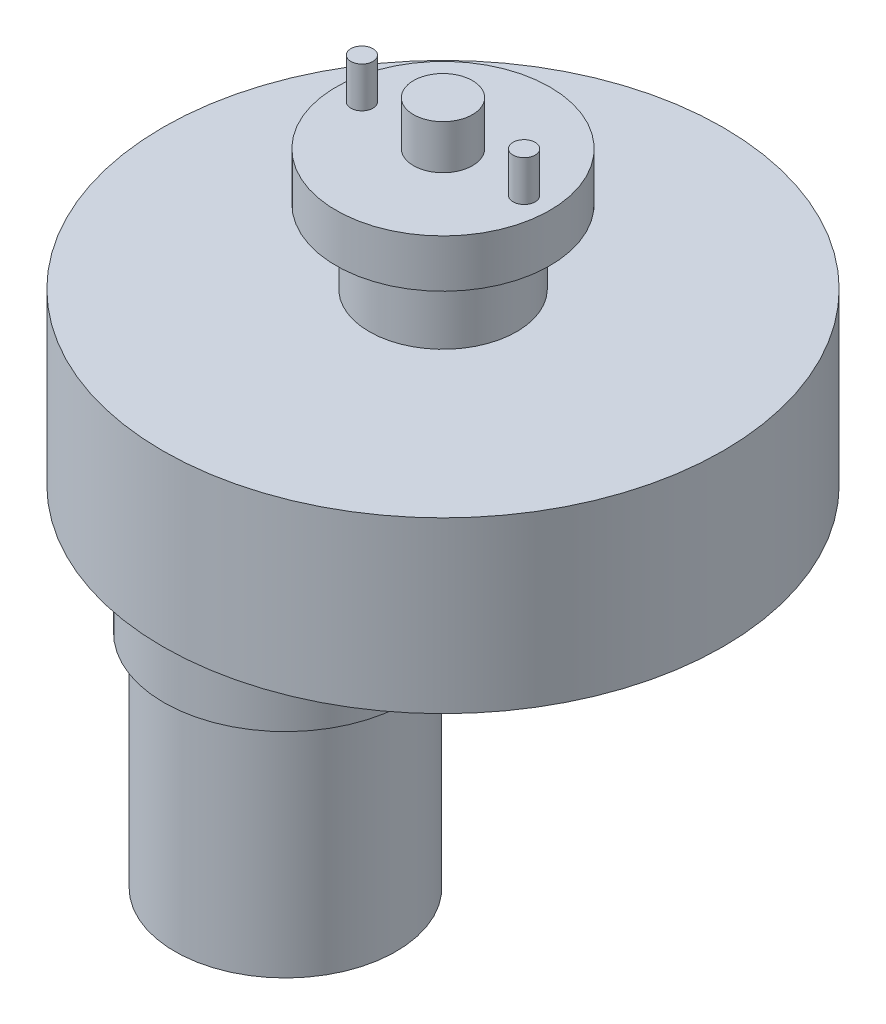
ISO-10303-21;
HEADER;
FILE_DESCRIPTION(('STEP AP214'),'2;1');
FILE_NAME('part.step','',(''),(''),'','','');
FILE_SCHEMA(('AUTOMOTIVE_DESIGN { 1 0 10303 214 1 1 1 1 }'));
ENDSEC;
DATA;
#1=APPLICATION_CONTEXT('core data for automotive mechanical design processes');
#2=APPLICATION_PROTOCOL_DEFINITION('international standard','automotive_design',2000,#1);
#3=PRODUCT_CONTEXT('',#1,'mechanical');
#4=PRODUCT('Part','Part','',(#3));
#5=PRODUCT_RELATED_PRODUCT_CATEGORY('part','',(#4));
#6=PRODUCT_DEFINITION_FORMATION('','',#4);
#7=PRODUCT_DEFINITION_CONTEXT('part definition',#1,'design');
#8=PRODUCT_DEFINITION('design','',#6,#7);
#9=PRODUCT_DEFINITION_SHAPE('','',#8);
#10=(LENGTH_UNIT() NAMED_UNIT(*) SI_UNIT(.MILLI.,.METRE.));
#11=(NAMED_UNIT(*) PLANE_ANGLE_UNIT() SI_UNIT($,.RADIAN.));
#12=(NAMED_UNIT(*) SI_UNIT($,.STERADIAN.) SOLID_ANGLE_UNIT());
#13=UNCERTAINTY_MEASURE_WITH_UNIT(LENGTH_MEASURE(1.E-05),#10,'distance_accuracy_value','');
#14=(GEOMETRIC_REPRESENTATION_CONTEXT(3) GLOBAL_UNCERTAINTY_ASSIGNED_CONTEXT((#13)) GLOBAL_UNIT_ASSIGNED_CONTEXT((#10,
#11,#12)) REPRESENTATION_CONTEXT('',''));
#15=CARTESIAN_POINT('',(0.,0.,0.));
#16=DIRECTION('',(0.,0.,1.));
#17=DIRECTION('',(1.,0.,0.));
#18=AXIS2_PLACEMENT_3D('',#15,#16,#17);
#19=CARTESIAN_POINT('',(-21.3727405232621,-28.,0.));
#20=DIRECTION('',(0.,-1.,0.));
#21=DIRECTION('',(0.,0.,-1.));
#22=AXIS2_PLACEMENT_3D('',#19,#20,#21);
#23=PLANE('',#22);
#24=CARTESIAN_POINT('',(-21.3727405232621,-28.,0.));
#25=DIRECTION('',(0.,-1.,0.));
#26=DIRECTION('',(0.,0.,-1.));
#27=AXIS2_PLACEMENT_3D('',#24,#25,#26);
#28=CIRCLE('',#27,16.5);
#29=CARTESIAN_POINT('',(-21.3727405232621,-28.,-16.5));
#30=VERTEX_POINT('',#29);
#31=EDGE_CURVE('E73',#30,#30,#28,.T.);
#32=ORIENTED_EDGE('',*,*,#31,.T.);
#33=EDGE_LOOP('',(#32));
#34=FACE_BOUND('',#33,.T.);
#35=CARTESIAN_POINT('',(-21.3727405232621,-28.,0.));
#36=DIRECTION('',(0.,-1.,0.));
#37=DIRECTION('',(0.,0.,-1.));
#38=AXIS2_PLACEMENT_3D('',#35,#36,#37);
#39=CIRCLE('',#38,15.);
#40=CARTESIAN_POINT('',(-21.3727405232621,-28.,-15.));
#41=VERTEX_POINT('',#40);
#42=EDGE_CURVE('E79',#41,#41,#39,.T.);
#43=ORIENTED_EDGE('',*,*,#42,.F.);
#44=EDGE_LOOP('',(#43));
#45=FACE_BOUND('',#44,.T.);
#46=ADVANCED_FACE('F28',(#34,#45),#23,.T.);
#47=CARTESIAN_POINT('',(0.,0.,0.));
#48=DIRECTION('',(0.,1.,0.));
#49=DIRECTION('',(0.,0.,1.));
#50=AXIS2_PLACEMENT_3D('',#47,#48,#49);
#51=PLANE('',#50);
#52=CARTESIAN_POINT('',(0.,0.,0.));
#53=DIRECTION('',(0.,1.,0.));
#54=DIRECTION('',(0.,0.,1.));
#55=AXIS2_PLACEMENT_3D('',#52,#53,#54);
#56=CIRCLE('',#55,38.);
#57=CARTESIAN_POINT('',(0.,0.,38.));
#58=VERTEX_POINT('',#57);
#59=EDGE_CURVE('E39',#58,#58,#56,.T.);
#60=ORIENTED_EDGE('',*,*,#59,.F.);
#61=EDGE_LOOP('',(#60));
#62=FACE_BOUND('',#61,.T.);
#63=CARTESIAN_POINT('',(-21.3727405232621,0.,0.));
#64=DIRECTION('',(0.,1.,0.));
#65=DIRECTION('',(0.,0.,1.));
#66=AXIS2_PLACEMENT_3D('',#63,#64,#65);
#67=CIRCLE('',#66,16.5);
#68=CARTESIAN_POINT('',(-21.3727405232621,0.,16.5));
#69=VERTEX_POINT('',#68);
#70=EDGE_CURVE('E10',#69,#69,#67,.F.);
#71=ORIENTED_EDGE('',*,*,#70,.F.);
#72=EDGE_LOOP('',(#71));
#73=FACE_BOUND('',#72,.T.);
#74=ADVANCED_FACE('F95',(#62,#73),#51,.F.);
#75=CARTESIAN_POINT('',(0.,39.5,0.));
#76=DIRECTION('',(0.,1.,0.));
#77=DIRECTION('',(0.,0.,1.));
#78=AXIS2_PLACEMENT_3D('',#75,#76,#77);
#79=PLANE('',#78);
#80=CARTESIAN_POINT('',(-11.,39.5,0.));
#81=DIRECTION('',(0.,1.,0.));
#82=DIRECTION('',(0.,0.,1.));
#83=AXIS2_PLACEMENT_3D('',#80,#81,#82);
#84=CIRCLE('',#83,1.5);
#85=CARTESIAN_POINT('',(-11.,39.5,1.5));
#86=VERTEX_POINT('',#85);
#87=EDGE_CURVE('E64',#86,#86,#84,.T.);
#88=ORIENTED_EDGE('',*,*,#87,.F.);
#89=EDGE_LOOP('',(#88));
#90=FACE_BOUND('',#89,.T.);
#91=CARTESIAN_POINT('',(0.,39.5,0.));
#92=DIRECTION('',(0.,1.,0.));
#93=DIRECTION('',(0.,0.,1.));
#94=AXIS2_PLACEMENT_3D('',#91,#92,#93);
#95=CIRCLE('',#94,14.5);
#96=CARTESIAN_POINT('',(0.,39.5,-14.5));
#97=VERTEX_POINT('',#96);
#98=EDGE_CURVE('E49',#97,#97,#95,.T.);
#99=ORIENTED_EDGE('',*,*,#98,.T.);
#100=EDGE_LOOP('',(#99));
#101=FACE_BOUND('',#100,.T.);
#102=CARTESIAN_POINT('',(0.,39.5,0.));
#103=DIRECTION('',(0.,1.,0.));
#104=DIRECTION('',(0.,0.,1.));
#105=AXIS2_PLACEMENT_3D('',#102,#103,#104);
#106=CIRCLE('',#105,4.);
#107=CARTESIAN_POINT('',(0.,39.5,4.));
#108=VERTEX_POINT('',#107);
#109=EDGE_CURVE('E58',#108,#108,#106,.T.);
#110=ORIENTED_EDGE('',*,*,#109,.F.);
#111=EDGE_LOOP('',(#110));
#112=FACE_BOUND('',#111,.T.);
#113=CARTESIAN_POINT('',(11.,39.5,0.));
#114=DIRECTION('',(0.,1.,0.));
#115=DIRECTION('',(0.,0.,1.));
#116=AXIS2_PLACEMENT_3D('',#113,#114,#115);
#117=CIRCLE('',#116,1.5);
#118=CARTESIAN_POINT('',(11.,39.5,1.5));
#119=VERTEX_POINT('',#118);
#120=EDGE_CURVE('E70',#119,#119,#117,.T.);
#121=ORIENTED_EDGE('',*,*,#120,.F.);
#122=EDGE_LOOP('',(#121));
#123=FACE_BOUND('',#122,.T.);
#124=ADVANCED_FACE('F101',(#90,#101,#112,#123),#79,.T.);
#125=CARTESIAN_POINT('',(0.,23.,0.));
#126=DIRECTION('',(0.,1.,0.));
#127=DIRECTION('',(0.,0.,1.));
#128=AXIS2_PLACEMENT_3D('',#125,#126,#127);
#129=PLANE('',#128);
#130=CARTESIAN_POINT('',(0.,23.,0.));
#131=DIRECTION('',(0.,1.,0.));
#132=DIRECTION('',(0.,0.,1.));
#133=AXIS2_PLACEMENT_3D('',#130,#131,#132);
#134=CIRCLE('',#133,38.);
#135=CARTESIAN_POINT('',(0.,23.,38.));
#136=VERTEX_POINT('',#135);
#137=EDGE_CURVE('E35',#136,#136,#134,.T.);
#138=ORIENTED_EDGE('',*,*,#137,.T.);
#139=EDGE_LOOP('',(#138));
#140=FACE_BOUND('',#139,.T.);
#141=CARTESIAN_POINT('',(0.,23.,0.));
#142=DIRECTION('',(0.,1.,0.));
#143=DIRECTION('',(0.,0.,1.));
#144=AXIS2_PLACEMENT_3D('',#141,#142,#143);
#145=CIRCLE('',#144,10.);
#146=CARTESIAN_POINT('',(0.,23.,10.));
#147=VERTEX_POINT('',#146);
#148=EDGE_CURVE('E46',#147,#147,#145,.T.);
#149=ORIENTED_EDGE('',*,*,#148,.F.);
#150=EDGE_LOOP('',(#149));
#151=FACE_BOUND('',#150,.T.);
#152=ADVANCED_FACE('F135',(#140,#151),#129,.T.);
#153=CARTESIAN_POINT('',(0.,23.,0.));
#154=DIRECTION('',(0.,-1.,0.));
#155=DIRECTION('',(0.,0.,-1.));
#156=AXIS2_PLACEMENT_3D('',#153,#154,#155);
#157=CYLINDRICAL_SURFACE('',#156,38.);
#158=ORIENTED_EDGE('',*,*,#137,.F.);
#159=EDGE_LOOP('',(#158));
#160=FACE_BOUND('',#159,.T.);
#161=ORIENTED_EDGE('',*,*,#59,.T.);
#162=EDGE_LOOP('',(#161));
#163=FACE_BOUND('',#162,.T.);
#164=ADVANCED_FACE('F30',(#160,#163),#157,.T.);
#165=CARTESIAN_POINT('',(0.,33.,0.));
#166=DIRECTION('',(0.,-1.,0.));
#167=DIRECTION('',(0.,0.,-1.));
#168=AXIS2_PLACEMENT_3D('',#165,#166,#167);
#169=CYLINDRICAL_SURFACE('',#168,10.);
#170=CARTESIAN_POINT('',(0.,33.,0.));
#171=DIRECTION('',(0.,1.,0.));
#172=DIRECTION('',(0.,0.,1.));
#173=AXIS2_PLACEMENT_3D('',#170,#171,#172);
#174=CIRCLE('',#173,10.);
#175=CARTESIAN_POINT('',(0.,33.,10.));
#176=VERTEX_POINT('',#175);
#177=EDGE_CURVE('E44',#176,#176,#174,.T.);
#178=ORIENTED_EDGE('',*,*,#177,.F.);
#179=EDGE_LOOP('',(#178));
#180=FACE_BOUND('',#179,.T.);
#181=ORIENTED_EDGE('',*,*,#148,.T.);
#182=EDGE_LOOP('',(#181));
#183=FACE_BOUND('',#182,.T.);
#184=ADVANCED_FACE('F140',(#180,#183),#169,.T.);
#185=CARTESIAN_POINT('',(0.,33.,0.));
#186=DIRECTION('',(0.,1.,0.));
#187=DIRECTION('',(0.,0.,1.));
#188=AXIS2_PLACEMENT_3D('',#185,#186,#187);
#189=PLANE('',#188);
#190=CARTESIAN_POINT('',(0.,33.,0.));
#191=DIRECTION('',(0.,1.,0.));
#192=DIRECTION('',(0.,0.,1.));
#193=AXIS2_PLACEMENT_3D('',#190,#191,#192);
#194=CIRCLE('',#193,14.5);
#195=CARTESIAN_POINT('',(0.,33.,-14.5));
#196=VERTEX_POINT('',#195);
#197=EDGE_CURVE('E52',#196,#196,#194,.T.);
#198=ORIENTED_EDGE('',*,*,#197,.F.);
#199=EDGE_LOOP('',(#198));
#200=FACE_BOUND('',#199,.T.);
#201=ORIENTED_EDGE('',*,*,#177,.T.);
#202=EDGE_LOOP('',(#201));
#203=FACE_BOUND('',#202,.T.);
#204=ADVANCED_FACE('F137',(#200,#203),#189,.F.);
#205=CARTESIAN_POINT('',(0.,39.5,0.));
#206=DIRECTION('',(0.,-1.,0.));
#207=DIRECTION('',(0.,0.,-1.));
#208=AXIS2_PLACEMENT_3D('',#205,#206,#207);
#209=CYLINDRICAL_SURFACE('',#208,14.5);
#210=CARTESIAN_POINT('',(0.,39.5,-14.5));
#211=CARTESIAN_POINT('',(0.,39.4322916666667,-14.5));
#212=CARTESIAN_POINT('',(0.,39.3645833333333,-14.5));
#213=CARTESIAN_POINT('',(0.,39.2291666666667,-14.5));
#214=CARTESIAN_POINT('',(0.,39.1614583333333,-14.5));
#215=CARTESIAN_POINT('',(0.,39.0260416666667,-14.5));
#216=CARTESIAN_POINT('',(0.,38.9583333333333,-14.5));
#217=CARTESIAN_POINT('',(0.,38.8229166666667,-14.5));
#218=CARTESIAN_POINT('',(0.,38.7552083333333,-14.5));
#219=CARTESIAN_POINT('',(0.,38.6197916666667,-14.5));
#220=CARTESIAN_POINT('',(0.,38.5520833333333,-14.5));
#221=CARTESIAN_POINT('',(0.,38.4166666666667,-14.5));
#222=CARTESIAN_POINT('',(0.,38.3489583333333,-14.5));
#223=CARTESIAN_POINT('',(0.,38.2135416666667,-14.5));
#224=CARTESIAN_POINT('',(0.,38.1458333333333,-14.5));
#225=CARTESIAN_POINT('',(0.,38.0104166666667,-14.5));
#226=CARTESIAN_POINT('',(0.,37.9427083333333,-14.5));
#227=CARTESIAN_POINT('',(0.,37.8072916666667,-14.5));
#228=CARTESIAN_POINT('',(0.,37.7395833333333,-14.5));
#229=CARTESIAN_POINT('',(0.,37.6041666666667,-14.5));
#230=CARTESIAN_POINT('',(0.,37.5364583333333,-14.5));
#231=CARTESIAN_POINT('',(0.,37.4010416666667,-14.5));
#232=CARTESIAN_POINT('',(0.,37.3333333333333,-14.5));
#233=CARTESIAN_POINT('',(0.,37.1979166666667,-14.5));
#234=CARTESIAN_POINT('',(0.,37.1302083333333,-14.5));
#235=CARTESIAN_POINT('',(0.,36.9947916666667,-14.5));
#236=CARTESIAN_POINT('',(0.,36.9270833333333,-14.5));
#237=CARTESIAN_POINT('',(0.,36.7916666666667,-14.5));
#238=CARTESIAN_POINT('',(0.,36.7239583333333,-14.5));
#239=CARTESIAN_POINT('',(0.,36.5885416666667,-14.5));
#240=CARTESIAN_POINT('',(0.,36.5208333333333,-14.5));
#241=CARTESIAN_POINT('',(0.,36.3854166666667,-14.5));
#242=CARTESIAN_POINT('',(0.,36.3177083333333,-14.5));
#243=CARTESIAN_POINT('',(0.,36.1822916666667,-14.5));
#244=CARTESIAN_POINT('',(0.,36.1145833333333,-14.5));
#245=CARTESIAN_POINT('',(0.,35.9791666666667,-14.5));
#246=CARTESIAN_POINT('',(0.,35.9114583333333,-14.5));
#247=CARTESIAN_POINT('',(0.,35.7760416666667,-14.5));
#248=CARTESIAN_POINT('',(0.,35.7083333333333,-14.5));
#249=CARTESIAN_POINT('',(0.,35.5729166666667,-14.5));
#250=CARTESIAN_POINT('',(0.,35.5052083333333,-14.5));
#251=CARTESIAN_POINT('',(0.,35.3697916666667,-14.5));
#252=CARTESIAN_POINT('',(0.,35.3020833333333,-14.5));
#253=CARTESIAN_POINT('',(0.,35.1666666666667,-14.5));
#254=CARTESIAN_POINT('',(0.,35.0989583333333,-14.5));
#255=CARTESIAN_POINT('',(0.,34.9635416666667,-14.5));
#256=CARTESIAN_POINT('',(0.,34.8958333333333,-14.5));
#257=CARTESIAN_POINT('',(0.,34.7604166666667,-14.5));
#258=CARTESIAN_POINT('',(0.,34.6927083333333,-14.5));
#259=CARTESIAN_POINT('',(0.,34.5572916666667,-14.5));
#260=CARTESIAN_POINT('',(0.,34.4895833333333,-14.5));
#261=CARTESIAN_POINT('',(0.,34.3541666666667,-14.5));
#262=CARTESIAN_POINT('',(0.,34.2864583333333,-14.5));
#263=CARTESIAN_POINT('',(0.,34.1510416666667,-14.5));
#264=CARTESIAN_POINT('',(0.,34.0833333333333,-14.5));
#265=CARTESIAN_POINT('',(0.,33.9479166666667,-14.5));
#266=CARTESIAN_POINT('',(0.,33.8802083333333,-14.5));
#267=CARTESIAN_POINT('',(0.,33.7447916666667,-14.5));
#268=CARTESIAN_POINT('',(0.,33.6770833333333,-14.5));
#269=CARTESIAN_POINT('',(0.,33.5416666666667,-14.5));
#270=CARTESIAN_POINT('',(0.,33.4739583333333,-14.5));
#271=CARTESIAN_POINT('',(0.,33.3385416666667,-14.5));
#272=CARTESIAN_POINT('',(0.,33.2708333333333,-14.5));
#273=CARTESIAN_POINT('',(0.,33.1354166666667,-14.5));
#274=CARTESIAN_POINT('',(0.,33.0677083333333,-14.5));
#275=CARTESIAN_POINT('',(0.,33.,-14.5));
#276=B_SPLINE_CURVE_WITH_KNOTS('',3,(#210,#211,#212,#213,#214,#215,#216,#217,#218,#219,#220,
#221,#222,#223,#224,#225,#226,#227,#228,#229,#230,#231,#232,#233,#234,#235,#236,#237,#238,#239,
#240,#241,#242,#243,#244,#245,#246,#247,#248,#249,#250,#251,#252,#253,#254,#255,#256,#257,#258,
#259,#260,#261,#262,#263,#264,#265,#266,#267,#268,#269,#270,#271,#272,#273,#274,#275),
.UNSPECIFIED.,.F.,.F.,(4,2,2,2,2,2,2,2,2,2,2,2,2,2,2,2,2,2,2,2,2,2,2,2,2,2,2,2,2,2,2,2,4),(0.,
0.203125000000005,0.406250000000004,0.609375000000002,0.812500000000001,1.01562500000001,
1.21875,1.421875,1.625,1.82812500000001,2.03125000000001,2.234375,2.4375,2.640625,
2.84375000000001,3.046875,3.25,3.453125,3.65625000000001,3.85937500000001,4.0625,4.265625,
4.46875,4.67187500000001,4.875,5.078125,5.28125,5.48437500000001,5.68750000000001,5.890625,
6.09375,6.296875,6.50000000000001),.UNSPECIFIED.);
#277=EDGE_CURVE('BSEAM131',#97,#196,#276,.T.);
#278=ORIENTED_EDGE('',*,*,#98,.F.);
#279=ORIENTED_EDGE('',*,*,#197,.T.);
#280=ORIENTED_EDGE('',*,*,#277,.T.);
#281=ORIENTED_EDGE('',*,*,#277,.F.);
#282=EDGE_LOOP('',(#278,#280,#279,#281));
#283=FACE_BOUND('',#282,.T.);
#284=ADVANCED_FACE('F131',(#283),#209,.T.);
#285=CARTESIAN_POINT('',(0.,45.5,0.));
#286=DIRECTION('',(0.,-1.,0.));
#287=DIRECTION('',(0.,0.,-1.));
#288=AXIS2_PLACEMENT_3D('',#285,#286,#287);
#289=CYLINDRICAL_SURFACE('',#288,4.);
#290=CARTESIAN_POINT('',(0.,45.5,0.));
#291=DIRECTION('',(0.,1.,0.));
#292=DIRECTION('',(0.,0.,1.));
#293=AXIS2_PLACEMENT_3D('',#290,#291,#292);
#294=CIRCLE('',#293,4.);
#295=CARTESIAN_POINT('',(0.,45.5,4.));
#296=VERTEX_POINT('',#295);
#297=EDGE_CURVE('E55',#296,#296,#294,.T.);
#298=ORIENTED_EDGE('',*,*,#297,.F.);
#299=EDGE_LOOP('',(#298));
#300=FACE_BOUND('',#299,.T.);
#301=ORIENTED_EDGE('',*,*,#109,.T.);
#302=EDGE_LOOP('',(#301));
#303=FACE_BOUND('',#302,.T.);
#304=ADVANCED_FACE('F127',(#300,#303),#289,.T.);
#305=CARTESIAN_POINT('',(0.,45.5,0.));
#306=DIRECTION('',(0.,1.,0.));
#307=DIRECTION('',(0.,0.,1.));
#308=AXIS2_PLACEMENT_3D('',#305,#306,#307);
#309=PLANE('',#308);
#310=ORIENTED_EDGE('',*,*,#297,.T.);
#311=EDGE_LOOP('',(#310));
#312=FACE_BOUND('',#311,.T.);
#313=ADVANCED_FACE('F123',(#312),#309,.T.);
#314=CARTESIAN_POINT('',(-11.,45.,0.));
#315=DIRECTION('',(0.,-1.,0.));
#316=DIRECTION('',(0.,0.,-1.));
#317=AXIS2_PLACEMENT_3D('',#314,#315,#316);
#318=CYLINDRICAL_SURFACE('',#317,1.5);
#319=CARTESIAN_POINT('',(-11.,45.,0.));
#320=DIRECTION('',(0.,1.,0.));
#321=DIRECTION('',(0.,0.,1.));
#322=AXIS2_PLACEMENT_3D('',#319,#320,#321);
#323=CIRCLE('',#322,1.5);
#324=CARTESIAN_POINT('',(-11.,45.,1.5));
#325=VERTEX_POINT('',#324);
#326=EDGE_CURVE('E61',#325,#325,#323,.T.);
#327=ORIENTED_EDGE('',*,*,#326,.F.);
#328=EDGE_LOOP('',(#327));
#329=FACE_BOUND('',#328,.T.);
#330=ORIENTED_EDGE('',*,*,#87,.T.);
#331=EDGE_LOOP('',(#330));
#332=FACE_BOUND('',#331,.T.);
#333=ADVANCED_FACE('F119',(#329,#332),#318,.T.);
#334=CARTESIAN_POINT('',(-11.,45.,0.));
#335=DIRECTION('',(0.,1.,0.));
#336=DIRECTION('',(0.,0.,1.));
#337=AXIS2_PLACEMENT_3D('',#334,#335,#336);
#338=PLANE('',#337);
#339=ORIENTED_EDGE('',*,*,#326,.T.);
#340=EDGE_LOOP('',(#339));
#341=FACE_BOUND('',#340,.T.);
#342=ADVANCED_FACE('F115',(#341),#338,.T.);
#343=CARTESIAN_POINT('',(11.,45.,0.));
#344=DIRECTION('',(0.,-1.,0.));
#345=DIRECTION('',(0.,0.,-1.));
#346=AXIS2_PLACEMENT_3D('',#343,#344,#345);
#347=CYLINDRICAL_SURFACE('',#346,1.5);
#348=CARTESIAN_POINT('',(11.,45.,0.));
#349=DIRECTION('',(0.,1.,0.));
#350=DIRECTION('',(0.,0.,1.));
#351=AXIS2_PLACEMENT_3D('',#348,#349,#350);
#352=CIRCLE('',#351,1.5);
#353=CARTESIAN_POINT('',(11.,45.,1.5));
#354=VERTEX_POINT('',#353);
#355=EDGE_CURVE('E67',#354,#354,#352,.T.);
#356=ORIENTED_EDGE('',*,*,#355,.F.);
#357=EDGE_LOOP('',(#356));
#358=FACE_BOUND('',#357,.T.);
#359=ORIENTED_EDGE('',*,*,#120,.T.);
#360=EDGE_LOOP('',(#359));
#361=FACE_BOUND('',#360,.T.);
#362=ADVANCED_FACE('F111',(#358,#361),#347,.T.);
#363=CARTESIAN_POINT('',(11.,45.,0.));
#364=DIRECTION('',(0.,1.,0.));
#365=DIRECTION('',(0.,0.,1.));
#366=AXIS2_PLACEMENT_3D('',#363,#364,#365);
#367=PLANE('',#366);
#368=ORIENTED_EDGE('',*,*,#355,.T.);
#369=EDGE_LOOP('',(#368));
#370=FACE_BOUND('',#369,.T.);
#371=ADVANCED_FACE('F107',(#370),#367,.T.);
#372=CARTESIAN_POINT('',(-21.3727405232621,-28.,0.));
#373=DIRECTION('',(0.,1.,0.));
#374=DIRECTION('',(0.,0.,1.));
#375=AXIS2_PLACEMENT_3D('',#372,#373,#374);
#376=CYLINDRICAL_SURFACE('',#375,16.5);
#377=ORIENTED_EDGE('',*,*,#31,.F.);
#378=EDGE_LOOP('',(#377));
#379=FACE_BOUND('',#378,.T.);
#380=ORIENTED_EDGE('',*,*,#70,.T.);
#381=EDGE_LOOP('',(#380));
#382=FACE_BOUND('',#381,.T.);
#383=ADVANCED_FACE('F90',(#379,#382),#376,.T.);
#384=CARTESIAN_POINT('',(-21.3727405232621,-58.,0.));
#385=DIRECTION('',(0.,1.,0.));
#386=DIRECTION('',(0.,0.,1.));
#387=AXIS2_PLACEMENT_3D('',#384,#385,#386);
#388=CYLINDRICAL_SURFACE('',#387,15.);
#389=CARTESIAN_POINT('',(-21.3727405232621,-58.,0.));
#390=DIRECTION('',(0.,-1.,0.));
#391=DIRECTION('',(0.,0.,-1.));
#392=AXIS2_PLACEMENT_3D('',#389,#390,#391);
#393=CIRCLE('',#392,15.);
#394=CARTESIAN_POINT('',(-21.3727405232621,-58.,-15.));
#395=VERTEX_POINT('',#394);
#396=EDGE_CURVE('E78',#395,#395,#393,.T.);
#397=ORIENTED_EDGE('',*,*,#396,.F.);
#398=EDGE_LOOP('',(#397));
#399=FACE_BOUND('',#398,.T.);
#400=ORIENTED_EDGE('',*,*,#42,.T.);
#401=EDGE_LOOP('',(#400));
#402=FACE_BOUND('',#401,.T.);
#403=ADVANCED_FACE('F87',(#399,#402),#388,.T.);
#404=CARTESIAN_POINT('',(-21.3727405232621,-58.,0.));
#405=DIRECTION('',(0.,-1.,0.));
#406=DIRECTION('',(0.,0.,-1.));
#407=AXIS2_PLACEMENT_3D('',#404,#405,#406);
#408=PLANE('',#407);
#409=ORIENTED_EDGE('',*,*,#396,.T.);
#410=EDGE_LOOP('',(#409));
#411=FACE_BOUND('',#410,.T.);
#412=ADVANCED_FACE('F85',(#411),#408,.T.);
#413=CLOSED_SHELL('',(#46,#74,#124,#152,#164,#184,#204,#284,#304,#313,#333,#342,#362,#371,#383,
#403,#412));
#414=MANIFOLD_SOLID_BREP('B2',#413);
#415=ADVANCED_BREP_SHAPE_REPRESENTATION('',(#18,#414),#14);
#416=SHAPE_DEFINITION_REPRESENTATION(#9,#415);
ENDSEC;
END-ISO-10303-21;
